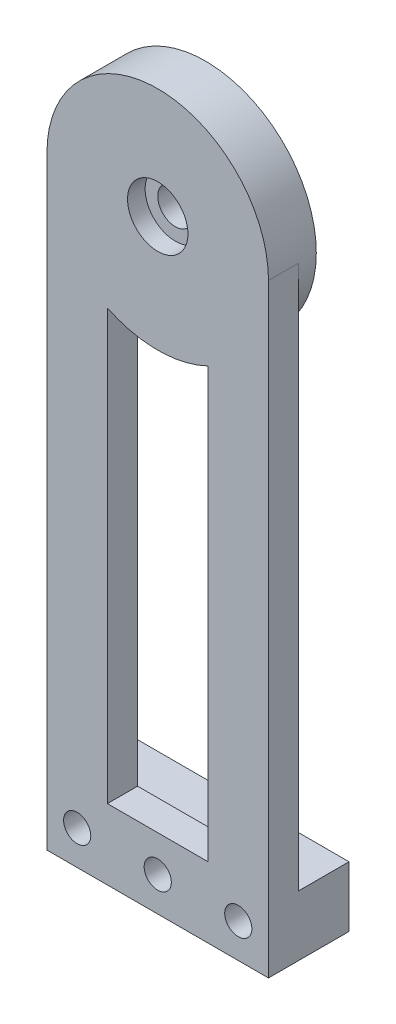
ISO-10303-21;
HEADER;
FILE_DESCRIPTION(('STEP AP214'),'2;1');
FILE_NAME('part.step','',(''),(''),'','','');
FILE_SCHEMA(('AUTOMOTIVE_DESIGN { 1 0 10303 214 1 1 1 1 }'));
ENDSEC;
DATA;
#1=APPLICATION_CONTEXT('core data for automotive mechanical design processes');
#2=APPLICATION_PROTOCOL_DEFINITION('international standard','automotive_design',2000,#1);
#3=PRODUCT_CONTEXT('',#1,'mechanical');
#4=PRODUCT('Part','Part','',(#3));
#5=PRODUCT_RELATED_PRODUCT_CATEGORY('part','',(#4));
#6=PRODUCT_DEFINITION_FORMATION('','',#4);
#7=PRODUCT_DEFINITION_CONTEXT('part definition',#1,'design');
#8=PRODUCT_DEFINITION('design','',#6,#7);
#9=PRODUCT_DEFINITION_SHAPE('','',#8);
#10=(LENGTH_UNIT() NAMED_UNIT(*) SI_UNIT(.MILLI.,.METRE.));
#11=(NAMED_UNIT(*) PLANE_ANGLE_UNIT() SI_UNIT($,.RADIAN.));
#12=(NAMED_UNIT(*) SI_UNIT($,.STERADIAN.) SOLID_ANGLE_UNIT());
#13=UNCERTAINTY_MEASURE_WITH_UNIT(LENGTH_MEASURE(1.E-05),#10,'distance_accuracy_value','');
#14=(GEOMETRIC_REPRESENTATION_CONTEXT(3) GLOBAL_UNCERTAINTY_ASSIGNED_CONTEXT((#13)) GLOBAL_UNIT_ASSIGNED_CONTEXT((#10,
#11,#12)) REPRESENTATION_CONTEXT('',''));
#15=CARTESIAN_POINT('',(0.,0.,0.));
#16=DIRECTION('',(0.,0.,1.));
#17=DIRECTION('',(1.,0.,0.));
#18=AXIS2_PLACEMENT_3D('',#15,#16,#17);
#19=CARTESIAN_POINT('',(0.,0.,0.));
#20=DIRECTION('',(0.,0.,1.));
#21=DIRECTION('',(1.,0.,0.));
#22=AXIS2_PLACEMENT_3D('',#19,#20,#21);
#23=PLANE('',#22);
#24=CARTESIAN_POINT('',(0.,30.,0.));
#25=DIRECTION('',(0.,0.,1.));
#26=DIRECTION('',(1.,0.,0.));
#27=AXIS2_PLACEMENT_3D('',#24,#25,#26);
#28=CIRCLE('',#27,11.5);
#29=CARTESIAN_POINT('',(-5.,19.643842411396,0.));
#30=VERTEX_POINT('',#29);
#31=CARTESIAN_POINT('',(5.,19.643842411396,0.));
#32=VERTEX_POINT('',#31);
#33=EDGE_CURVE('E180',#30,#32,#28,.T.);
#34=ORIENTED_EDGE('',*,*,#33,.F.);
#35=DIRECTION('',(0.,-1.,0.));
#36=VECTOR('',#35,1.);
#37=CARTESIAN_POINT('',(-5.,0.,0.));
#38=LINE('',#37,#36);
#39=CARTESIAN_POINT('',(-5.00000000000001,-23.,0.));
#40=VERTEX_POINT('',#39);
#41=EDGE_CURVE('E145',#30,#40,#38,.T.);
#42=ORIENTED_EDGE('',*,*,#41,.T.);
#43=DIRECTION('',(1.,0.,0.));
#44=VECTOR('',#43,1.);
#45=CARTESIAN_POINT('',(0.,-23.,0.));
#46=LINE('',#45,#44);
#47=CARTESIAN_POINT('',(5.00000000000001,-23.,0.));
#48=VERTEX_POINT('',#47);
#49=EDGE_CURVE('E188',#40,#48,#46,.T.);
#50=ORIENTED_EDGE('',*,*,#49,.T.);
#51=DIRECTION('',(0.,-1.,0.));
#52=VECTOR('',#51,1.);
#53=CARTESIAN_POINT('',(5.,0.,0.));
#54=LINE('',#53,#52);
#55=EDGE_CURVE('E183',#32,#48,#54,.T.);
#56=ORIENTED_EDGE('',*,*,#55,.F.);
#57=EDGE_LOOP('',(#34,#42,#50,#56));
#58=FACE_BOUND('',#57,.T.);
#59=DIRECTION('',(1.,0.,0.));
#60=VECTOR('',#59,1.);
#61=CARTESIAN_POINT('',(0.,-24.,0.));
#62=LINE('',#61,#60);
#63=CARTESIAN_POINT('',(-11.,-24.,0.));
#64=VERTEX_POINT('',#63);
#65=CARTESIAN_POINT('',(11.,-24.,0.));
#66=VERTEX_POINT('',#65);
#67=EDGE_CURVE('E251',#64,#66,#62,.T.);
#68=ORIENTED_EDGE('',*,*,#67,.F.);
#69=DIRECTION('',(0.,-1.,0.));
#70=VECTOR('',#69,1.);
#71=CARTESIAN_POINT('',(-11.,0.,0.));
#72=LINE('',#71,#70);
#73=CARTESIAN_POINT('',(-11.,30.,0.));
#74=VERTEX_POINT('',#73);
#75=EDGE_CURVE('E162',#74,#64,#72,.T.);
#76=ORIENTED_EDGE('',*,*,#75,.F.);
#77=CARTESIAN_POINT('',(0.,30.,0.));
#78=DIRECTION('',(0.,0.,1.));
#79=DIRECTION('',(1.,0.,0.));
#80=AXIS2_PLACEMENT_3D('',#77,#78,#79);
#81=CIRCLE('',#80,11.);
#82=CARTESIAN_POINT('',(11.,30.,0.));
#83=VERTEX_POINT('',#82);
#84=EDGE_CURVE('E13',#74,#83,#81,.T.);
#85=ORIENTED_EDGE('',*,*,#84,.T.);
#86=DIRECTION('',(0.,-1.,0.));
#87=VECTOR('',#86,1.);
#88=CARTESIAN_POINT('',(11.,0.,0.));
#89=LINE('',#88,#87);
#90=EDGE_CURVE('E194',#83,#66,#89,.T.);
#91=ORIENTED_EDGE('',*,*,#90,.T.);
#92=EDGE_LOOP('',(#68,#76,#85,#91));
#93=FACE_BOUND('',#92,.T.);
#94=ADVANCED_FACE('F67',(#58,#93),#23,.F.);
#95=CARTESIAN_POINT('',(0.,30.,-6.69974746830584));
#96=DIRECTION('',(0.,0.,1.));
#97=DIRECTION('',(1.,0.,0.));
#98=AXIS2_PLACEMENT_3D('',#95,#96,#97);
#99=CYLINDRICAL_SURFACE('',#98,1.75);
#100=CARTESIAN_POINT('',(0.,30.,-1.75));
#101=DIRECTION('',(0.,0.,1.));
#102=DIRECTION('',(1.,0.,0.));
#103=AXIS2_PLACEMENT_3D('',#100,#101,#102);
#104=CIRCLE('',#103,1.75);
#105=CARTESIAN_POINT('',(1.74999999999999,30.,-1.75));
#106=VERTEX_POINT('',#105);
#107=EDGE_CURVE('E274',#106,#106,#104,.F.);
#108=ORIENTED_EDGE('',*,*,#107,.T.);
#109=EDGE_LOOP('',(#108));
#110=FACE_BOUND('',#109,.T.);
#111=CARTESIAN_POINT('',(0.,30.,1.25));
#112=DIRECTION('',(0.,0.,1.));
#113=DIRECTION('',(1.,0.,0.));
#114=AXIS2_PLACEMENT_3D('',#111,#112,#113);
#115=CIRCLE('',#114,1.75);
#116=CARTESIAN_POINT('',(1.74999999999999,30.,1.25));
#117=VERTEX_POINT('',#116);
#118=EDGE_CURVE('E259',#117,#117,#115,.F.);
#119=ORIENTED_EDGE('',*,*,#118,.F.);
#120=EDGE_LOOP('',(#119));
#121=FACE_BOUND('',#120,.T.);
#122=ADVANCED_FACE('F290',(#110,#121),#99,.F.);
#123=CARTESIAN_POINT('',(11.,0.,3.));
#124=DIRECTION('',(1.,0.,0.));
#125=DIRECTION('',(0.,0.,-1.));
#126=AXIS2_PLACEMENT_3D('',#123,#124,#125);
#127=PLANE('',#126);
#128=ORIENTED_EDGE('',*,*,#90,.F.);
#129=DIRECTION('',(0.,0.,-1.));
#130=VECTOR('',#129,1.);
#131=CARTESIAN_POINT('',(11.,30.,3.));
#132=LINE('',#131,#130);
#133=CARTESIAN_POINT('',(11.,30.,3.));
#134=VERTEX_POINT('',#133);
#135=EDGE_CURVE('E78',#134,#83,#132,.T.);
#136=ORIENTED_EDGE('',*,*,#135,.F.);
#137=DIRECTION('',(0.,-1.,0.));
#138=VECTOR('',#137,1.);
#139=CARTESIAN_POINT('',(11.,0.,3.));
#140=LINE('',#139,#138);
#141=CARTESIAN_POINT('',(11.,-30.,3.));
#142=VERTEX_POINT('',#141);
#143=EDGE_CURVE('E113',#134,#142,#140,.T.);
#144=ORIENTED_EDGE('',*,*,#143,.T.);
#145=DIRECTION('',(0.,0.,-1.));
#146=VECTOR('',#145,1.);
#147=CARTESIAN_POINT('',(11.,-30.,3.));
#148=LINE('',#147,#146);
#149=CARTESIAN_POINT('',(11.,-30.,-5.));
#150=VERTEX_POINT('',#149);
#151=EDGE_CURVE('E71',#142,#150,#148,.T.);
#152=ORIENTED_EDGE('',*,*,#151,.T.);
#153=DIRECTION('',(0.,-1.,0.));
#154=VECTOR('',#153,1.);
#155=CARTESIAN_POINT('',(11.,0.,-5.));
#156=LINE('',#155,#154);
#157=CARTESIAN_POINT('',(11.,-24.,-5.));
#158=VERTEX_POINT('',#157);
#159=EDGE_CURVE('E230',#158,#150,#156,.T.);
#160=ORIENTED_EDGE('',*,*,#159,.F.);
#161=DIRECTION('',(0.,0.,1.));
#162=VECTOR('',#161,1.);
#163=CARTESIAN_POINT('',(11.,-24.,-5.));
#164=LINE('',#163,#162);
#165=EDGE_CURVE('E256',#158,#66,#164,.T.);
#166=ORIENTED_EDGE('',*,*,#165,.T.);
#167=EDGE_LOOP('',(#128,#136,#144,#152,#160,#166));
#168=FACE_BOUND('',#167,.T.);
#169=ADVANCED_FACE('F228',(#168),#127,.T.);
#170=CARTESIAN_POINT('',(0.,30.,3.));
#171=DIRECTION('',(0.,0.,-1.));
#172=DIRECTION('',(-1.,0.,0.));
#173=AXIS2_PLACEMENT_3D('',#170,#171,#172);
#174=CYLINDRICAL_SURFACE('',#173,11.);
#175=ORIENTED_EDGE('',*,*,#135,.T.);
#176=ORIENTED_EDGE('',*,*,#84,.F.);
#177=DIRECTION('',(0.,0.,-1.));
#178=VECTOR('',#177,1.);
#179=CARTESIAN_POINT('',(-11.,30.,3.));
#180=LINE('',#179,#178);
#181=CARTESIAN_POINT('',(-11.,30.,3.));
#182=VERTEX_POINT('',#181);
#183=EDGE_CURVE('E201',#182,#74,#180,.T.);
#184=ORIENTED_EDGE('',*,*,#183,.F.);
#185=CARTESIAN_POINT('',(0.,30.,3.));
#186=DIRECTION('',(0.,0.,1.));
#187=DIRECTION('',(1.,0.,0.));
#188=AXIS2_PLACEMENT_3D('',#185,#186,#187);
#189=CIRCLE('',#188,11.);
#190=EDGE_CURVE('E87',#134,#182,#189,.T.);
#191=ORIENTED_EDGE('',*,*,#190,.F.);
#192=EDGE_LOOP('',(#175,#176,#184,#191));
#193=FACE_BOUND('',#192,.T.);
#194=CARTESIAN_POINT('',(0.,30.,-1.75));
#195=DIRECTION('',(0.,0.,1.));
#196=DIRECTION('',(1.,0.,0.));
#197=AXIS2_PLACEMENT_3D('',#194,#195,#196);
#198=CIRCLE('',#197,11.);
#199=CARTESIAN_POINT('',(11.,30.,-1.75));
#200=VERTEX_POINT('',#199);
#201=EDGE_CURVE('E215',#200,#200,#198,.T.);
#202=ORIENTED_EDGE('',*,*,#201,.T.);
#203=EDGE_LOOP('',(#202));
#204=FACE_BOUND('',#203,.T.);
#205=ADVANCED_FACE('F301',(#193,#204),#174,.T.);
#206=CARTESIAN_POINT('',(0.,30.,3.));
#207=DIRECTION('',(0.,0.,-1.));
#208=DIRECTION('',(-1.,0.,0.));
#209=AXIS2_PLACEMENT_3D('',#206,#207,#208);
#210=CYLINDRICAL_SURFACE('',#209,11.5);
#211=ORIENTED_EDGE('',*,*,#33,.T.);
#212=DIRECTION('',(0.,0.,-1.));
#213=VECTOR('',#212,1.);
#214=CARTESIAN_POINT('',(5.,19.643842411396,3.));
#215=LINE('',#214,#213);
#216=CARTESIAN_POINT('',(5.,19.643842411396,3.));
#217=VERTEX_POINT('',#216);
#218=EDGE_CURVE('E158',#217,#32,#215,.T.);
#219=ORIENTED_EDGE('',*,*,#218,.F.);
#220=CARTESIAN_POINT('',(0.,30.,3.));
#221=DIRECTION('',(0.,0.,1.));
#222=DIRECTION('',(1.,0.,0.));
#223=AXIS2_PLACEMENT_3D('',#220,#221,#222);
#224=CIRCLE('',#223,11.5);
#225=CARTESIAN_POINT('',(-5.,19.643842411396,3.));
#226=VERTEX_POINT('',#225);
#227=EDGE_CURVE('E155',#226,#217,#224,.T.);
#228=ORIENTED_EDGE('',*,*,#227,.F.);
#229=DIRECTION('',(0.,0.,-1.));
#230=VECTOR('',#229,1.);
#231=CARTESIAN_POINT('',(-5.,19.643842411396,3.));
#232=LINE('',#231,#230);
#233=EDGE_CURVE('E139',#226,#30,#232,.T.);
#234=ORIENTED_EDGE('',*,*,#233,.T.);
#235=EDGE_LOOP('',(#211,#219,#228,#234));
#236=FACE_BOUND('',#235,.T.);
#237=ADVANCED_FACE('F156',(#236),#210,.T.);
#238=CARTESIAN_POINT('',(5.,0.,3.));
#239=DIRECTION('',(1.,0.,0.));
#240=DIRECTION('',(0.,1.,0.));
#241=AXIS2_PLACEMENT_3D('',#238,#239,#240);
#242=PLANE('',#241);
#243=ORIENTED_EDGE('',*,*,#55,.T.);
#244=DIRECTION('',(0.,0.,-1.));
#245=VECTOR('',#244,1.);
#246=CARTESIAN_POINT('',(5.00000000000001,-23.,3.));
#247=LINE('',#246,#245);
#248=CARTESIAN_POINT('',(5.00000000000001,-23.,3.));
#249=VERTEX_POINT('',#248);
#250=EDGE_CURVE('E208',#249,#48,#247,.T.);
#251=ORIENTED_EDGE('',*,*,#250,.F.);
#252=DIRECTION('',(0.,-1.,0.));
#253=VECTOR('',#252,1.);
#254=CARTESIAN_POINT('',(5.,0.,3.));
#255=LINE('',#254,#253);
#256=EDGE_CURVE('E161',#217,#249,#255,.T.);
#257=ORIENTED_EDGE('',*,*,#256,.F.);
#258=ORIENTED_EDGE('',*,*,#218,.T.);
#259=EDGE_LOOP('',(#243,#251,#257,#258));
#260=FACE_BOUND('',#259,.T.);
#261=ADVANCED_FACE('F283',(#260),#242,.F.);
#262=CARTESIAN_POINT('',(0.,-23.,3.));
#263=DIRECTION('',(0.,1.,0.));
#264=DIRECTION('',(0.,0.,1.));
#265=AXIS2_PLACEMENT_3D('',#262,#263,#264);
#266=PLANE('',#265);
#267=ORIENTED_EDGE('',*,*,#49,.F.);
#268=DIRECTION('',(0.,0.,-1.));
#269=VECTOR('',#268,1.);
#270=CARTESIAN_POINT('',(-5.00000000000001,-23.,3.));
#271=LINE('',#270,#269);
#272=CARTESIAN_POINT('',(-5.00000000000001,-23.,3.));
#273=VERTEX_POINT('',#272);
#274=EDGE_CURVE('E150',#273,#40,#271,.T.);
#275=ORIENTED_EDGE('',*,*,#274,.F.);
#276=DIRECTION('',(1.,0.,0.));
#277=VECTOR('',#276,1.);
#278=CARTESIAN_POINT('',(0.,-23.,3.));
#279=LINE('',#278,#277);
#280=EDGE_CURVE('E167',#273,#249,#279,.T.);
#281=ORIENTED_EDGE('',*,*,#280,.T.);
#282=ORIENTED_EDGE('',*,*,#250,.T.);
#283=EDGE_LOOP('',(#267,#275,#281,#282));
#284=FACE_BOUND('',#283,.T.);
#285=ADVANCED_FACE('F286',(#284),#266,.T.);
#286=CARTESIAN_POINT('',(-5.,0.,3.));
#287=DIRECTION('',(1.,0.,0.));
#288=DIRECTION('',(0.,1.,0.));
#289=AXIS2_PLACEMENT_3D('',#286,#287,#288);
#290=PLANE('',#289);
#291=ORIENTED_EDGE('',*,*,#41,.F.);
#292=ORIENTED_EDGE('',*,*,#233,.F.);
#293=DIRECTION('',(0.,-1.,0.));
#294=VECTOR('',#293,1.);
#295=CARTESIAN_POINT('',(-5.,0.,3.));
#296=LINE('',#295,#294);
#297=EDGE_CURVE('E143',#226,#273,#296,.T.);
#298=ORIENTED_EDGE('',*,*,#297,.T.);
#299=ORIENTED_EDGE('',*,*,#274,.T.);
#300=EDGE_LOOP('',(#291,#292,#298,#299));
#301=FACE_BOUND('',#300,.T.);
#302=ADVANCED_FACE('F141',(#301),#290,.T.);
#303=CARTESIAN_POINT('',(-11.,0.,3.));
#304=DIRECTION('',(1.,0.,0.));
#305=DIRECTION('',(0.,0.,-1.));
#306=AXIS2_PLACEMENT_3D('',#303,#304,#305);
#307=PLANE('',#306);
#308=ORIENTED_EDGE('',*,*,#75,.T.);
#309=DIRECTION('',(0.,0.,1.));
#310=VECTOR('',#309,1.);
#311=CARTESIAN_POINT('',(-11.,-24.,-5.));
#312=LINE('',#311,#310);
#313=CARTESIAN_POINT('',(-11.,-24.,-5.));
#314=VERTEX_POINT('',#313);
#315=EDGE_CURVE('E242',#314,#64,#312,.T.);
#316=ORIENTED_EDGE('',*,*,#315,.F.);
#317=DIRECTION('',(0.,-1.,0.));
#318=VECTOR('',#317,1.);
#319=CARTESIAN_POINT('',(-11.,0.,-5.));
#320=LINE('',#319,#318);
#321=CARTESIAN_POINT('',(-11.,-30.,-5.));
#322=VERTEX_POINT('',#321);
#323=EDGE_CURVE('E245',#314,#322,#320,.T.);
#324=ORIENTED_EDGE('',*,*,#323,.T.);
#325=DIRECTION('',(0.,0.,-1.));
#326=VECTOR('',#325,1.);
#327=CARTESIAN_POINT('',(-11.,-30.,3.));
#328=LINE('',#327,#326);
#329=CARTESIAN_POINT('',(-11.,-30.,3.));
#330=VERTEX_POINT('',#329);
#331=EDGE_CURVE('E184',#330,#322,#328,.T.);
#332=ORIENTED_EDGE('',*,*,#331,.F.);
#333=DIRECTION('',(0.,-1.,0.));
#334=VECTOR('',#333,1.);
#335=CARTESIAN_POINT('',(-11.,0.,3.));
#336=LINE('',#335,#334);
#337=EDGE_CURVE('E151',#182,#330,#336,.T.);
#338=ORIENTED_EDGE('',*,*,#337,.F.);
#339=ORIENTED_EDGE('',*,*,#183,.T.);
#340=EDGE_LOOP('',(#308,#316,#324,#332,#338,#339));
#341=FACE_BOUND('',#340,.T.);
#342=ADVANCED_FACE('F298',(#341),#307,.F.);
#343=CARTESIAN_POINT('',(0.,0.,3.));
#344=DIRECTION('',(0.,0.,1.));
#345=DIRECTION('',(1.,0.,0.));
#346=AXIS2_PLACEMENT_3D('',#343,#344,#345);
#347=PLANE('',#346);
#348=CARTESIAN_POINT('',(8.,-26.6,3.));
#349=DIRECTION('',(0.,0.,1.));
#350=DIRECTION('',(1.,0.,0.));
#351=AXIS2_PLACEMENT_3D('',#348,#349,#350);
#352=CIRCLE('',#351,1.35);
#353=CARTESIAN_POINT('',(9.35,-26.6,3.));
#354=VERTEX_POINT('',#353);
#355=EDGE_CURVE('E315',#354,#354,#352,.T.);
#356=ORIENTED_EDGE('',*,*,#355,.F.);
#357=EDGE_LOOP('',(#356));
#358=FACE_BOUND('',#357,.T.);
#359=CARTESIAN_POINT('',(-8.,-26.6,3.));
#360=DIRECTION('',(0.,0.,1.));
#361=DIRECTION('',(1.,0.,0.));
#362=AXIS2_PLACEMENT_3D('',#359,#360,#361);
#363=CIRCLE('',#362,1.35);
#364=CARTESIAN_POINT('',(-6.65,-26.6,3.));
#365=VERTEX_POINT('',#364);
#366=EDGE_CURVE('E316',#365,#365,#363,.T.);
#367=ORIENTED_EDGE('',*,*,#366,.F.);
#368=EDGE_LOOP('',(#367));
#369=FACE_BOUND('',#368,.T.);
#370=CARTESIAN_POINT('',(0.,-26.6,3.));
#371=DIRECTION('',(0.,0.,1.));
#372=DIRECTION('',(1.,0.,0.));
#373=AXIS2_PLACEMENT_3D('',#370,#371,#372);
#374=CIRCLE('',#373,1.35);
#375=CARTESIAN_POINT('',(1.35,-26.6,3.));
#376=VERTEX_POINT('',#375);
#377=EDGE_CURVE('E311',#376,#376,#374,.T.);
#378=ORIENTED_EDGE('',*,*,#377,.F.);
#379=EDGE_LOOP('',(#378));
#380=FACE_BOUND('',#379,.T.);
#381=CARTESIAN_POINT('',(0.,30.,3.));
#382=DIRECTION('',(0.,0.,1.));
#383=DIRECTION('',(1.,0.,0.));
#384=AXIS2_PLACEMENT_3D('',#381,#382,#383);
#385=CIRCLE('',#384,3.);
#386=CARTESIAN_POINT('',(2.99999999999999,30.,3.));
#387=VERTEX_POINT('',#386);
#388=EDGE_CURVE('E263',#387,#387,#385,.T.);
#389=ORIENTED_EDGE('',*,*,#388,.F.);
#390=EDGE_LOOP('',(#389));
#391=FACE_BOUND('',#390,.T.);
#392=ORIENTED_EDGE('',*,*,#227,.T.);
#393=ORIENTED_EDGE('',*,*,#256,.T.);
#394=ORIENTED_EDGE('',*,*,#280,.F.);
#395=ORIENTED_EDGE('',*,*,#297,.F.);
#396=EDGE_LOOP('',(#392,#393,#394,#395));
#397=FACE_BOUND('',#396,.T.);
#398=ORIENTED_EDGE('',*,*,#337,.T.);
#399=DIRECTION('',(1.,0.,0.));
#400=VECTOR('',#399,1.);
#401=CARTESIAN_POINT('',(-11.,-30.,3.));
#402=LINE('',#401,#400);
#403=EDGE_CURVE('E213',#330,#142,#402,.T.);
#404=ORIENTED_EDGE('',*,*,#403,.T.);
#405=ORIENTED_EDGE('',*,*,#143,.F.);
#406=ORIENTED_EDGE('',*,*,#190,.T.);
#407=EDGE_LOOP('',(#398,#404,#405,#406));
#408=FACE_BOUND('',#407,.T.);
#409=ADVANCED_FACE('F165',(#358,#369,#380,#391,#397,#408),#347,.T.);
#410=CARTESIAN_POINT('',(-11.,-30.,3.));
#411=DIRECTION('',(0.,1.,0.));
#412=DIRECTION('',(0.,0.,1.));
#413=AXIS2_PLACEMENT_3D('',#410,#411,#412);
#414=PLANE('',#413);
#415=ORIENTED_EDGE('',*,*,#331,.T.);
#416=DIRECTION('',(1.,0.,0.));
#417=VECTOR('',#416,1.);
#418=CARTESIAN_POINT('',(0.,-30.,-5.));
#419=LINE('',#418,#417);
#420=EDGE_CURVE('E236',#322,#150,#419,.T.);
#421=ORIENTED_EDGE('',*,*,#420,.T.);
#422=ORIENTED_EDGE('',*,*,#151,.F.);
#423=ORIENTED_EDGE('',*,*,#403,.F.);
#424=EDGE_LOOP('',(#415,#421,#422,#423));
#425=FACE_BOUND('',#424,.T.);
#426=ADVANCED_FACE('F69',(#425),#414,.F.);
#427=CARTESIAN_POINT('',(0.,0.,-1.75));
#428=DIRECTION('',(0.,0.,1.));
#429=DIRECTION('',(1.,0.,0.));
#430=AXIS2_PLACEMENT_3D('',#427,#428,#429);
#431=PLANE('',#430);
#432=ORIENTED_EDGE('',*,*,#107,.F.);
#433=EDGE_LOOP('',(#432));
#434=FACE_BOUND('',#433,.T.);
#435=ORIENTED_EDGE('',*,*,#201,.F.);
#436=EDGE_LOOP('',(#435));
#437=FACE_BOUND('',#436,.T.);
#438=ADVANCED_FACE('F353',(#434,#437),#431,.F.);
#439=CARTESIAN_POINT('',(0.,30.,-10.2352813742386));
#440=DIRECTION('',(0.,0.,1.));
#441=DIRECTION('',(1.,0.,0.));
#442=AXIS2_PLACEMENT_3D('',#439,#440,#441);
#443=CYLINDRICAL_SURFACE('',#442,3.);
#444=CARTESIAN_POINT('',(0.,30.,1.25));
#445=DIRECTION('',(0.,0.,1.));
#446=DIRECTION('',(1.,0.,0.));
#447=AXIS2_PLACEMENT_3D('',#444,#445,#446);
#448=CIRCLE('',#447,3.);
#449=CARTESIAN_POINT('',(2.99999999999999,30.,1.25));
#450=VERTEX_POINT('',#449);
#451=EDGE_CURVE('E267',#450,#450,#448,.F.);
#452=ORIENTED_EDGE('',*,*,#451,.T.);
#453=EDGE_LOOP('',(#452));
#454=FACE_BOUND('',#453,.T.);
#455=ORIENTED_EDGE('',*,*,#388,.T.);
#456=EDGE_LOOP('',(#455));
#457=FACE_BOUND('',#456,.T.);
#458=ADVANCED_FACE('F356',(#454,#457),#443,.F.);
#459=CARTESIAN_POINT('',(0.,0.,1.25));
#460=DIRECTION('',(0.,0.,1.));
#461=DIRECTION('',(1.,0.,0.));
#462=AXIS2_PLACEMENT_3D('',#459,#460,#461);
#463=PLANE('',#462);
#464=ORIENTED_EDGE('',*,*,#451,.F.);
#465=EDGE_LOOP('',(#464));
#466=FACE_BOUND('',#465,.T.);
#467=ORIENTED_EDGE('',*,*,#118,.T.);
#468=EDGE_LOOP('',(#467));
#469=FACE_BOUND('',#468,.T.);
#470=ADVANCED_FACE('F358',(#466,#469),#463,.T.);
#471=CARTESIAN_POINT('',(0.,-24.,-5.));
#472=DIRECTION('',(0.,-1.,0.));
#473=DIRECTION('',(0.,0.,-1.));
#474=AXIS2_PLACEMENT_3D('',#471,#472,#473);
#475=PLANE('',#474);
#476=ORIENTED_EDGE('',*,*,#67,.T.);
#477=ORIENTED_EDGE('',*,*,#165,.F.);
#478=DIRECTION('',(1.,0.,0.));
#479=VECTOR('',#478,1.);
#480=CARTESIAN_POINT('',(0.,-24.,-5.));
#481=LINE('',#480,#479);
#482=EDGE_CURVE('E239',#314,#158,#481,.T.);
#483=ORIENTED_EDGE('',*,*,#482,.F.);
#484=ORIENTED_EDGE('',*,*,#315,.T.);
#485=EDGE_LOOP('',(#476,#477,#483,#484));
#486=FACE_BOUND('',#485,.T.);
#487=ADVANCED_FACE('F305',(#486),#475,.F.);
#488=CARTESIAN_POINT('',(0.,0.,-5.));
#489=DIRECTION('',(0.,0.,1.));
#490=DIRECTION('',(1.,0.,0.));
#491=AXIS2_PLACEMENT_3D('',#488,#489,#490);
#492=PLANE('',#491);
#493=CARTESIAN_POINT('',(8.,-26.6,-5.));
#494=DIRECTION('',(0.,0.,1.));
#495=DIRECTION('',(1.,0.,0.));
#496=AXIS2_PLACEMENT_3D('',#493,#494,#495);
#497=CIRCLE('',#496,1.35);
#498=CARTESIAN_POINT('',(9.35,-26.6,-5.));
#499=VERTEX_POINT('',#498);
#500=EDGE_CURVE('E320',#499,#499,#497,.F.);
#501=ORIENTED_EDGE('',*,*,#500,.F.);
#502=EDGE_LOOP('',(#501));
#503=FACE_BOUND('',#502,.T.);
#504=CARTESIAN_POINT('',(-8.,-26.6,-5.));
#505=DIRECTION('',(0.,0.,1.));
#506=DIRECTION('',(1.,0.,0.));
#507=AXIS2_PLACEMENT_3D('',#504,#505,#506);
#508=CIRCLE('',#507,1.35);
#509=CARTESIAN_POINT('',(-6.65,-26.6,-5.));
#510=VERTEX_POINT('',#509);
#511=EDGE_CURVE('E321',#510,#510,#508,.F.);
#512=ORIENTED_EDGE('',*,*,#511,.F.);
#513=EDGE_LOOP('',(#512));
#514=FACE_BOUND('',#513,.T.);
#515=CARTESIAN_POINT('',(0.,-26.6,-5.));
#516=DIRECTION('',(0.,0.,1.));
#517=DIRECTION('',(1.,0.,0.));
#518=AXIS2_PLACEMENT_3D('',#515,#516,#517);
#519=CIRCLE('',#518,1.35);
#520=CARTESIAN_POINT('',(1.35,-26.6,-5.));
#521=VERTEX_POINT('',#520);
#522=EDGE_CURVE('E255',#521,#521,#519,.F.);
#523=ORIENTED_EDGE('',*,*,#522,.F.);
#524=EDGE_LOOP('',(#523));
#525=FACE_BOUND('',#524,.T.);
#526=ORIENTED_EDGE('',*,*,#482,.T.);
#527=ORIENTED_EDGE('',*,*,#159,.T.);
#528=ORIENTED_EDGE('',*,*,#420,.F.);
#529=ORIENTED_EDGE('',*,*,#323,.F.);
#530=EDGE_LOOP('',(#526,#527,#528,#529));
#531=FACE_BOUND('',#530,.T.);
#532=ADVANCED_FACE('F234',(#503,#514,#525,#531),#492,.F.);
#533=CARTESIAN_POINT('',(0.,-26.6,-8.81837661840736));
#534=DIRECTION('',(0.,0.,1.));
#535=DIRECTION('',(1.,0.,0.));
#536=AXIS2_PLACEMENT_3D('',#533,#534,#535);
#537=CYLINDRICAL_SURFACE('',#536,1.35);
#538=CARTESIAN_POINT('',(1.35,-26.6,-5.));
#539=CARTESIAN_POINT('',(1.35,-26.6,-4.91666666666667));
#540=CARTESIAN_POINT('',(1.35,-26.6,-4.83333333333333));
#541=CARTESIAN_POINT('',(1.35,-26.6,-4.66666666666667));
#542=CARTESIAN_POINT('',(1.35,-26.6,-4.58333333333333));
#543=CARTESIAN_POINT('',(1.35,-26.6,-4.41666666666667));
#544=CARTESIAN_POINT('',(1.35,-26.6,-4.33333333333333));
#545=CARTESIAN_POINT('',(1.35,-26.6,-4.16666666666667));
#546=CARTESIAN_POINT('',(1.35,-26.6,-4.08333333333333));
#547=CARTESIAN_POINT('',(1.35,-26.6,-3.91666666666667));
#548=CARTESIAN_POINT('',(1.35,-26.6,-3.83333333333333));
#549=CARTESIAN_POINT('',(1.35,-26.6,-3.66666666666667));
#550=CARTESIAN_POINT('',(1.35,-26.6,-3.58333333333333));
#551=CARTESIAN_POINT('',(1.35,-26.6,-3.41666666666667));
#552=CARTESIAN_POINT('',(1.35,-26.6,-3.33333333333333));
#553=CARTESIAN_POINT('',(1.35,-26.6,-3.16666666666667));
#554=CARTESIAN_POINT('',(1.35,-26.6,-3.08333333333333));
#555=CARTESIAN_POINT('',(1.35,-26.6,-2.91666666666667));
#556=CARTESIAN_POINT('',(1.35,-26.6,-2.83333333333333));
#557=CARTESIAN_POINT('',(1.35,-26.6,-2.66666666666667));
#558=CARTESIAN_POINT('',(1.35,-26.6,-2.58333333333333));
#559=CARTESIAN_POINT('',(1.35,-26.6,-2.41666666666667));
#560=CARTESIAN_POINT('',(1.35,-26.6,-2.33333333333333));
#561=CARTESIAN_POINT('',(1.35,-26.6,-2.16666666666667));
#562=CARTESIAN_POINT('',(1.35,-26.6,-2.08333333333333));
#563=CARTESIAN_POINT('',(1.35,-26.6,-1.91666666666667));
#564=CARTESIAN_POINT('',(1.35,-26.6,-1.83333333333333));
#565=CARTESIAN_POINT('',(1.35,-26.6,-1.66666666666667));
#566=CARTESIAN_POINT('',(1.35,-26.6,-1.58333333333333));
#567=CARTESIAN_POINT('',(1.35,-26.6,-1.41666666666667));
#568=CARTESIAN_POINT('',(1.35,-26.6,-1.33333333333333));
#569=CARTESIAN_POINT('',(1.35,-26.6,-1.16666666666667));
#570=CARTESIAN_POINT('',(1.35,-26.6,-1.08333333333333));
#571=CARTESIAN_POINT('',(1.35,-26.6,-0.916666666666666));
#572=CARTESIAN_POINT('',(1.35,-26.6,-0.833333333333332));
#573=CARTESIAN_POINT('',(1.35,-26.6,-0.666666666666666));
#574=CARTESIAN_POINT('',(1.35,-26.6,-0.583333333333332));
#575=CARTESIAN_POINT('',(1.35,-26.6,-0.416666666666665));
#576=CARTESIAN_POINT('',(1.35,-26.6,-0.333333333333332));
#577=CARTESIAN_POINT('',(1.35,-26.6,-0.166666666666665));
#578=CARTESIAN_POINT('',(1.35,-26.6,-0.0833333333333317));
#579=CARTESIAN_POINT('',(1.35,-26.6,0.0833333333333345));
#580=CARTESIAN_POINT('',(1.35,-26.6,0.166666666666667));
#581=CARTESIAN_POINT('',(1.35,-26.6,0.333333333333334));
#582=CARTESIAN_POINT('',(1.35,-26.6,0.416666666666667));
#583=CARTESIAN_POINT('',(1.35,-26.6,0.583333333333334));
#584=CARTESIAN_POINT('',(1.35,-26.6,0.666666666666667));
#585=CARTESIAN_POINT('',(1.35,-26.6,0.833333333333334));
#586=CARTESIAN_POINT('',(1.35,-26.6,0.916666666666668));
#587=CARTESIAN_POINT('',(1.35,-26.6,1.08333333333333));
#588=CARTESIAN_POINT('',(1.35,-26.6,1.16666666666667));
#589=CARTESIAN_POINT('',(1.35,-26.6,1.33333333333333));
#590=CARTESIAN_POINT('',(1.35,-26.6,1.41666666666667));
#591=CARTESIAN_POINT('',(1.35,-26.6,1.58333333333333));
#592=CARTESIAN_POINT('',(1.35,-26.6,1.66666666666667));
#593=CARTESIAN_POINT('',(1.35,-26.6,1.83333333333333));
#594=CARTESIAN_POINT('',(1.35,-26.6,1.91666666666667));
#595=CARTESIAN_POINT('',(1.35,-26.6,2.08333333333333));
#596=CARTESIAN_POINT('',(1.35,-26.6,2.16666666666667));
#597=CARTESIAN_POINT('',(1.35,-26.6,2.33333333333333));
#598=CARTESIAN_POINT('',(1.35,-26.6,2.41666666666667));
#599=CARTESIAN_POINT('',(1.35,-26.6,2.58333333333333));
#600=CARTESIAN_POINT('',(1.35,-26.6,2.66666666666667));
#601=CARTESIAN_POINT('',(1.35,-26.6,2.83333333333333));
#602=CARTESIAN_POINT('',(1.35,-26.6,2.91666666666667));
#603=CARTESIAN_POINT('',(1.35,-26.6,3.));
#604=B_SPLINE_CURVE_WITH_KNOTS('',3,(#538,#539,#540,#541,#542,#543,#544,#545,#546,#547,#548,
#549,#550,#551,#552,#553,#554,#555,#556,#557,#558,#559,#560,#561,#562,#563,#564,#565,#566,#567,
#568,#569,#570,#571,#572,#573,#574,#575,#576,#577,#578,#579,#580,#581,#582,#583,#584,#585,#586,
#587,#588,#589,#590,#591,#592,#593,#594,#595,#596,#597,#598,#599,#600,#601,#602,#603),
.UNSPECIFIED.,.F.,.F.,(4,2,2,2,2,2,2,2,2,2,2,2,2,2,2,2,2,2,2,2,2,2,2,2,2,2,2,2,2,2,2,2,4),(0.,
0.25,0.5,0.750000000000001,1.,1.25,1.5,1.75,2.,2.25,2.5,2.75,3.,3.25,3.5,3.75,4.,4.25,4.5,4.75,
5.,5.25,5.5,5.75,6.,6.25,6.5,6.75,7.,7.25,7.5,7.75,8.),.UNSPECIFIED.);
#605=EDGE_CURVE('BSEAM337',#521,#376,#604,.T.);
#606=ORIENTED_EDGE('',*,*,#522,.T.);
#607=ORIENTED_EDGE('',*,*,#377,.T.);
#608=ORIENTED_EDGE('',*,*,#605,.T.);
#609=ORIENTED_EDGE('',*,*,#605,.F.);
#610=EDGE_LOOP('',(#606,#608,#607,#609));
#611=FACE_BOUND('',#610,.T.);
#612=ADVANCED_FACE('F337',(#611),#537,.F.);
#613=CARTESIAN_POINT('',(-8.,-26.6,-8.81837661840736));
#614=DIRECTION('',(0.,0.,1.));
#615=DIRECTION('',(1.,0.,0.));
#616=AXIS2_PLACEMENT_3D('',#613,#614,#615);
#617=CYLINDRICAL_SURFACE('',#616,1.35);
#618=CARTESIAN_POINT('',(-6.65,-26.6,-5.));
#619=CARTESIAN_POINT('',(-6.65,-26.6,-4.91666666666667));
#620=CARTESIAN_POINT('',(-6.65,-26.6,-4.83333333333333));
#621=CARTESIAN_POINT('',(-6.65,-26.6,-4.66666666666667));
#622=CARTESIAN_POINT('',(-6.65,-26.6,-4.58333333333333));
#623=CARTESIAN_POINT('',(-6.65,-26.6,-4.41666666666667));
#624=CARTESIAN_POINT('',(-6.65,-26.6,-4.33333333333333));
#625=CARTESIAN_POINT('',(-6.65,-26.6,-4.16666666666667));
#626=CARTESIAN_POINT('',(-6.65,-26.6,-4.08333333333333));
#627=CARTESIAN_POINT('',(-6.65,-26.6,-3.91666666666667));
#628=CARTESIAN_POINT('',(-6.65,-26.6,-3.83333333333333));
#629=CARTESIAN_POINT('',(-6.65,-26.6,-3.66666666666667));
#630=CARTESIAN_POINT('',(-6.65,-26.6,-3.58333333333333));
#631=CARTESIAN_POINT('',(-6.65,-26.6,-3.41666666666667));
#632=CARTESIAN_POINT('',(-6.65,-26.6,-3.33333333333333));
#633=CARTESIAN_POINT('',(-6.65,-26.6,-3.16666666666667));
#634=CARTESIAN_POINT('',(-6.65,-26.6,-3.08333333333333));
#635=CARTESIAN_POINT('',(-6.65,-26.6,-2.91666666666667));
#636=CARTESIAN_POINT('',(-6.65,-26.6,-2.83333333333333));
#637=CARTESIAN_POINT('',(-6.65,-26.6,-2.66666666666667));
#638=CARTESIAN_POINT('',(-6.65,-26.6,-2.58333333333333));
#639=CARTESIAN_POINT('',(-6.65,-26.6,-2.41666666666667));
#640=CARTESIAN_POINT('',(-6.65,-26.6,-2.33333333333333));
#641=CARTESIAN_POINT('',(-6.65,-26.6,-2.16666666666667));
#642=CARTESIAN_POINT('',(-6.65,-26.6,-2.08333333333333));
#643=CARTESIAN_POINT('',(-6.65,-26.6,-1.91666666666667));
#644=CARTESIAN_POINT('',(-6.65,-26.6,-1.83333333333333));
#645=CARTESIAN_POINT('',(-6.65,-26.6,-1.66666666666667));
#646=CARTESIAN_POINT('',(-6.65,-26.6,-1.58333333333333));
#647=CARTESIAN_POINT('',(-6.65,-26.6,-1.41666666666667));
#648=CARTESIAN_POINT('',(-6.65,-26.6,-1.33333333333333));
#649=CARTESIAN_POINT('',(-6.65,-26.6,-1.16666666666667));
#650=CARTESIAN_POINT('',(-6.65,-26.6,-1.08333333333333));
#651=CARTESIAN_POINT('',(-6.65,-26.6,-0.916666666666666));
#652=CARTESIAN_POINT('',(-6.65,-26.6,-0.833333333333332));
#653=CARTESIAN_POINT('',(-6.65,-26.6,-0.666666666666666));
#654=CARTESIAN_POINT('',(-6.65,-26.6,-0.583333333333332));
#655=CARTESIAN_POINT('',(-6.65,-26.6,-0.416666666666665));
#656=CARTESIAN_POINT('',(-6.65,-26.6,-0.333333333333332));
#657=CARTESIAN_POINT('',(-6.65,-26.6,-0.166666666666665));
#658=CARTESIAN_POINT('',(-6.65,-26.6,-0.0833333333333317));
#659=CARTESIAN_POINT('',(-6.65,-26.6,0.0833333333333345));
#660=CARTESIAN_POINT('',(-6.65,-26.6,0.166666666666667));
#661=CARTESIAN_POINT('',(-6.65,-26.6,0.333333333333334));
#662=CARTESIAN_POINT('',(-6.65,-26.6,0.416666666666667));
#663=CARTESIAN_POINT('',(-6.65,-26.6,0.583333333333334));
#664=CARTESIAN_POINT('',(-6.65,-26.6,0.666666666666667));
#665=CARTESIAN_POINT('',(-6.65,-26.6,0.833333333333334));
#666=CARTESIAN_POINT('',(-6.65,-26.6,0.916666666666668));
#667=CARTESIAN_POINT('',(-6.65,-26.6,1.08333333333333));
#668=CARTESIAN_POINT('',(-6.65,-26.6,1.16666666666667));
#669=CARTESIAN_POINT('',(-6.65,-26.6,1.33333333333333));
#670=CARTESIAN_POINT('',(-6.65,-26.6,1.41666666666667));
#671=CARTESIAN_POINT('',(-6.65,-26.6,1.58333333333333));
#672=CARTESIAN_POINT('',(-6.65,-26.6,1.66666666666667));
#673=CARTESIAN_POINT('',(-6.65,-26.6,1.83333333333333));
#674=CARTESIAN_POINT('',(-6.65,-26.6,1.91666666666667));
#675=CARTESIAN_POINT('',(-6.65,-26.6,2.08333333333333));
#676=CARTESIAN_POINT('',(-6.65,-26.6,2.16666666666667));
#677=CARTESIAN_POINT('',(-6.65,-26.6,2.33333333333333));
#678=CARTESIAN_POINT('',(-6.65,-26.6,2.41666666666667));
#679=CARTESIAN_POINT('',(-6.65,-26.6,2.58333333333333));
#680=CARTESIAN_POINT('',(-6.65,-26.6,2.66666666666667));
#681=CARTESIAN_POINT('',(-6.65,-26.6,2.83333333333333));
#682=CARTESIAN_POINT('',(-6.65,-26.6,2.91666666666667));
#683=CARTESIAN_POINT('',(-6.65,-26.6,3.));
#684=B_SPLINE_CURVE_WITH_KNOTS('',3,(#618,#619,#620,#621,#622,#623,#624,#625,#626,#627,#628,
#629,#630,#631,#632,#633,#634,#635,#636,#637,#638,#639,#640,#641,#642,#643,#644,#645,#646,#647,
#648,#649,#650,#651,#652,#653,#654,#655,#656,#657,#658,#659,#660,#661,#662,#663,#664,#665,#666,
#667,#668,#669,#670,#671,#672,#673,#674,#675,#676,#677,#678,#679,#680,#681,#682,#683),
.UNSPECIFIED.,.F.,.F.,(4,2,2,2,2,2,2,2,2,2,2,2,2,2,2,2,2,2,2,2,2,2,2,2,2,2,2,2,2,2,2,2,4),(0.,
0.25,0.5,0.750000000000001,1.,1.25,1.5,1.75,2.,2.25,2.5,2.75,3.,3.25,3.5,3.75,4.,4.25,4.5,4.75,
5.,5.25,5.5,5.75,6.,6.25,6.5,6.75,7.,7.25,7.5,7.75,8.),.UNSPECIFIED.);
#685=EDGE_CURVE('BSEAM345',#510,#365,#684,.T.);
#686=ORIENTED_EDGE('',*,*,#511,.T.);
#687=ORIENTED_EDGE('',*,*,#366,.T.);
#688=ORIENTED_EDGE('',*,*,#685,.T.);
#689=ORIENTED_EDGE('',*,*,#685,.F.);
#690=EDGE_LOOP('',(#686,#688,#687,#689));
#691=FACE_BOUND('',#690,.T.);
#692=ADVANCED_FACE('F345',(#691),#617,.F.);
#693=CARTESIAN_POINT('',(8.,-26.6,-8.81837661840736));
#694=DIRECTION('',(0.,0.,1.));
#695=DIRECTION('',(1.,0.,0.));
#696=AXIS2_PLACEMENT_3D('',#693,#694,#695);
#697=CYLINDRICAL_SURFACE('',#696,1.35);
#698=CARTESIAN_POINT('',(9.35,-26.6,-5.));
#699=CARTESIAN_POINT('',(9.35,-26.6,-4.91666666666667));
#700=CARTESIAN_POINT('',(9.35,-26.6,-4.83333333333333));
#701=CARTESIAN_POINT('',(9.35,-26.6,-4.66666666666667));
#702=CARTESIAN_POINT('',(9.35,-26.6,-4.58333333333333));
#703=CARTESIAN_POINT('',(9.35,-26.6,-4.41666666666667));
#704=CARTESIAN_POINT('',(9.35,-26.6,-4.33333333333333));
#705=CARTESIAN_POINT('',(9.35,-26.6,-4.16666666666667));
#706=CARTESIAN_POINT('',(9.35,-26.6,-4.08333333333333));
#707=CARTESIAN_POINT('',(9.35,-26.6,-3.91666666666667));
#708=CARTESIAN_POINT('',(9.35,-26.6,-3.83333333333333));
#709=CARTESIAN_POINT('',(9.35,-26.6,-3.66666666666667));
#710=CARTESIAN_POINT('',(9.35,-26.6,-3.58333333333333));
#711=CARTESIAN_POINT('',(9.35,-26.6,-3.41666666666667));
#712=CARTESIAN_POINT('',(9.35,-26.6,-3.33333333333333));
#713=CARTESIAN_POINT('',(9.35,-26.6,-3.16666666666667));
#714=CARTESIAN_POINT('',(9.35,-26.6,-3.08333333333333));
#715=CARTESIAN_POINT('',(9.35,-26.6,-2.91666666666667));
#716=CARTESIAN_POINT('',(9.35,-26.6,-2.83333333333333));
#717=CARTESIAN_POINT('',(9.35,-26.6,-2.66666666666667));
#718=CARTESIAN_POINT('',(9.35,-26.6,-2.58333333333333));
#719=CARTESIAN_POINT('',(9.35,-26.6,-2.41666666666667));
#720=CARTESIAN_POINT('',(9.35,-26.6,-2.33333333333333));
#721=CARTESIAN_POINT('',(9.35,-26.6,-2.16666666666667));
#722=CARTESIAN_POINT('',(9.35,-26.6,-2.08333333333333));
#723=CARTESIAN_POINT('',(9.35,-26.6,-1.91666666666667));
#724=CARTESIAN_POINT('',(9.35,-26.6,-1.83333333333333));
#725=CARTESIAN_POINT('',(9.35,-26.6,-1.66666666666667));
#726=CARTESIAN_POINT('',(9.35,-26.6,-1.58333333333333));
#727=CARTESIAN_POINT('',(9.35,-26.6,-1.41666666666667));
#728=CARTESIAN_POINT('',(9.35,-26.6,-1.33333333333333));
#729=CARTESIAN_POINT('',(9.35,-26.6,-1.16666666666667));
#730=CARTESIAN_POINT('',(9.35,-26.6,-1.08333333333333));
#731=CARTESIAN_POINT('',(9.35,-26.6,-0.916666666666666));
#732=CARTESIAN_POINT('',(9.35,-26.6,-0.833333333333332));
#733=CARTESIAN_POINT('',(9.35,-26.6,-0.666666666666666));
#734=CARTESIAN_POINT('',(9.35,-26.6,-0.583333333333332));
#735=CARTESIAN_POINT('',(9.35,-26.6,-0.416666666666665));
#736=CARTESIAN_POINT('',(9.35,-26.6,-0.333333333333332));
#737=CARTESIAN_POINT('',(9.35,-26.6,-0.166666666666665));
#738=CARTESIAN_POINT('',(9.35,-26.6,-0.0833333333333317));
#739=CARTESIAN_POINT('',(9.35,-26.6,0.0833333333333345));
#740=CARTESIAN_POINT('',(9.35,-26.6,0.166666666666667));
#741=CARTESIAN_POINT('',(9.35,-26.6,0.333333333333334));
#742=CARTESIAN_POINT('',(9.35,-26.6,0.416666666666667));
#743=CARTESIAN_POINT('',(9.35,-26.6,0.583333333333334));
#744=CARTESIAN_POINT('',(9.35,-26.6,0.666666666666667));
#745=CARTESIAN_POINT('',(9.35,-26.6,0.833333333333334));
#746=CARTESIAN_POINT('',(9.35,-26.6,0.916666666666668));
#747=CARTESIAN_POINT('',(9.35,-26.6,1.08333333333333));
#748=CARTESIAN_POINT('',(9.35,-26.6,1.16666666666667));
#749=CARTESIAN_POINT('',(9.35,-26.6,1.33333333333333));
#750=CARTESIAN_POINT('',(9.35,-26.6,1.41666666666667));
#751=CARTESIAN_POINT('',(9.35,-26.6,1.58333333333333));
#752=CARTESIAN_POINT('',(9.35,-26.6,1.66666666666667));
#753=CARTESIAN_POINT('',(9.35,-26.6,1.83333333333333));
#754=CARTESIAN_POINT('',(9.35,-26.6,1.91666666666667));
#755=CARTESIAN_POINT('',(9.35,-26.6,2.08333333333333));
#756=CARTESIAN_POINT('',(9.35,-26.6,2.16666666666667));
#757=CARTESIAN_POINT('',(9.35,-26.6,2.33333333333333));
#758=CARTESIAN_POINT('',(9.35,-26.6,2.41666666666667));
#759=CARTESIAN_POINT('',(9.35,-26.6,2.58333333333333));
#760=CARTESIAN_POINT('',(9.35,-26.6,2.66666666666667));
#761=CARTESIAN_POINT('',(9.35,-26.6,2.83333333333333));
#762=CARTESIAN_POINT('',(9.35,-26.6,2.91666666666667));
#763=CARTESIAN_POINT('',(9.35,-26.6,3.));
#764=B_SPLINE_CURVE_WITH_KNOTS('',3,(#698,#699,#700,#701,#702,#703,#704,#705,#706,#707,#708,
#709,#710,#711,#712,#713,#714,#715,#716,#717,#718,#719,#720,#721,#722,#723,#724,#725,#726,#727,
#728,#729,#730,#731,#732,#733,#734,#735,#736,#737,#738,#739,#740,#741,#742,#743,#744,#745,#746,
#747,#748,#749,#750,#751,#752,#753,#754,#755,#756,#757,#758,#759,#760,#761,#762,#763),
.UNSPECIFIED.,.F.,.F.,(4,2,2,2,2,2,2,2,2,2,2,2,2,2,2,2,2,2,2,2,2,2,2,2,2,2,2,2,2,2,2,2,4),(0.,
0.25,0.5,0.750000000000001,1.,1.25,1.5,1.75,2.,2.25,2.5,2.75,3.,3.25,3.5,3.75,4.,4.25,4.5,4.75,
5.,5.25,5.5,5.75,6.,6.25,6.5,6.75,7.,7.25,7.5,7.75,8.),.UNSPECIFIED.);
#765=EDGE_CURVE('BSEAM332',#499,#354,#764,.T.);
#766=ORIENTED_EDGE('',*,*,#500,.T.);
#767=ORIENTED_EDGE('',*,*,#355,.T.);
#768=ORIENTED_EDGE('',*,*,#765,.T.);
#769=ORIENTED_EDGE('',*,*,#765,.F.);
#770=EDGE_LOOP('',(#766,#768,#767,#769));
#771=FACE_BOUND('',#770,.T.);
#772=ADVANCED_FACE('F332',(#771),#697,.F.);
#773=CLOSED_SHELL('',(#94,#122,#169,#205,#237,#261,#285,#302,#342,#409,#426,#438,#458,#470,#487,
#532,#612,#692,#772));
#774=MANIFOLD_SOLID_BREP('B2',#773);
#775=ADVANCED_BREP_SHAPE_REPRESENTATION('',(#18,#774),#14);
#776=SHAPE_DEFINITION_REPRESENTATION(#9,#775);
ENDSEC;
END-ISO-10303-21;
